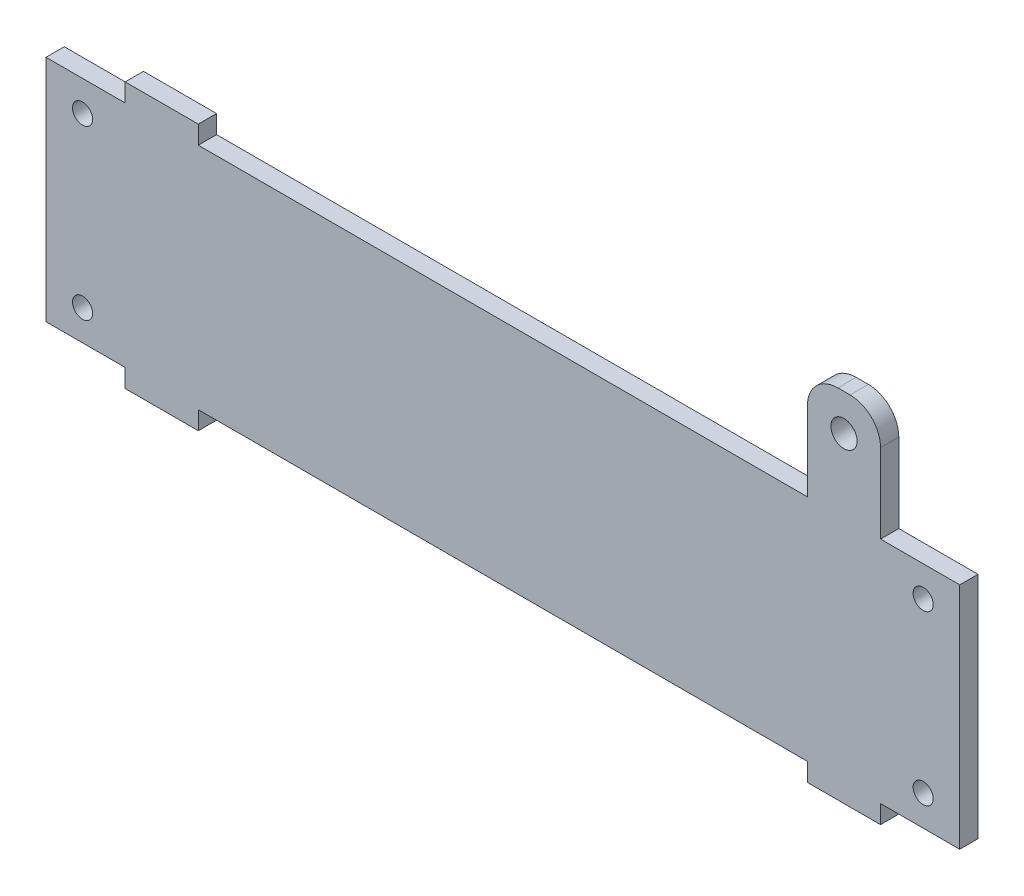
ISO-10303-21;
HEADER;
FILE_DESCRIPTION(('STEP AP214'),'2;1');
FILE_NAME('part.step','',(''),(''),'','','');
FILE_SCHEMA(('AUTOMOTIVE_DESIGN { 1 0 10303 214 1 1 1 1 }'));
ENDSEC;
DATA;
#1=APPLICATION_CONTEXT('core data for automotive mechanical design processes');
#2=APPLICATION_PROTOCOL_DEFINITION('international standard','automotive_design',2000,#1);
#3=PRODUCT_CONTEXT('',#1,'mechanical');
#4=PRODUCT('Part','Part','',(#3));
#5=PRODUCT_RELATED_PRODUCT_CATEGORY('part','',(#4));
#6=PRODUCT_DEFINITION_FORMATION('','',#4);
#7=PRODUCT_DEFINITION_CONTEXT('part definition',#1,'design');
#8=PRODUCT_DEFINITION('design','',#6,#7);
#9=PRODUCT_DEFINITION_SHAPE('','',#8);
#10=(LENGTH_UNIT() NAMED_UNIT(*) SI_UNIT(.MILLI.,.METRE.));
#11=(NAMED_UNIT(*) PLANE_ANGLE_UNIT() SI_UNIT($,.RADIAN.));
#12=(NAMED_UNIT(*) SI_UNIT($,.STERADIAN.) SOLID_ANGLE_UNIT());
#13=UNCERTAINTY_MEASURE_WITH_UNIT(LENGTH_MEASURE(1.E-05),#10,'distance_accuracy_value','');
#14=(GEOMETRIC_REPRESENTATION_CONTEXT(3) GLOBAL_UNCERTAINTY_ASSIGNED_CONTEXT((#13)) GLOBAL_UNIT_ASSIGNED_CONTEXT((#10,
#11,#12)) REPRESENTATION_CONTEXT('',''));
#15=CARTESIAN_POINT('',(0.,0.,0.));
#16=DIRECTION('',(0.,0.,1.));
#17=DIRECTION('',(1.,0.,0.));
#18=AXIS2_PLACEMENT_3D('',#15,#16,#17);
#19=CARTESIAN_POINT('',(0.,0.,3.));
#20=DIRECTION('',(0.,0.,-1.));
#21=DIRECTION('',(-1.,0.,0.));
#22=AXIS2_PLACEMENT_3D('',#19,#20,#21);
#23=PLANE('',#22);
#24=DIRECTION('',(0.,1.,0.));
#25=VECTOR('',#24,1.);
#26=CARTESIAN_POINT('',(137.,37.6,3.));
#27=LINE('',#26,#25);
#28=CARTESIAN_POINT('',(137.,37.6,3.));
#29=VERTEX_POINT('',#28);
#30=CARTESIAN_POINT('',(137.,50.6,3.));
#31=VERTEX_POINT('',#30);
#32=EDGE_CURVE('E229',#29,#31,#27,.T.);
#33=ORIENTED_EDGE('',*,*,#32,.T.);
#34=CARTESIAN_POINT('',(132.,50.6,3.));
#35=DIRECTION('',(0.,0.,-1.));
#36=DIRECTION('',(-1.,0.,0.));
#37=AXIS2_PLACEMENT_3D('',#34,#35,#36);
#38=CIRCLE('',#37,5.);
#39=CARTESIAN_POINT('',(132.,55.6,3.));
#40=VERTEX_POINT('',#39);
#41=EDGE_CURVE('E43',#31,#40,#38,.F.);
#42=ORIENTED_EDGE('',*,*,#41,.T.);
#43=DIRECTION('',(-1.,0.,0.));
#44=VECTOR('',#43,1.);
#45=CARTESIAN_POINT('',(125.,55.6,3.));
#46=LINE('',#45,#44);
#47=CARTESIAN_POINT('',(130.,55.6,3.));
#48=VERTEX_POINT('',#47);
#49=EDGE_CURVE('E228',#40,#48,#46,.T.);
#50=ORIENTED_EDGE('',*,*,#49,.T.);
#51=CARTESIAN_POINT('',(130.,50.6,3.));
#52=DIRECTION('',(0.,0.,-1.));
#53=DIRECTION('',(-1.,0.,0.));
#54=AXIS2_PLACEMENT_3D('',#51,#52,#53);
#55=CIRCLE('',#54,5.);
#56=CARTESIAN_POINT('',(125.,50.6,3.));
#57=VERTEX_POINT('',#56);
#58=EDGE_CURVE('E50',#48,#57,#55,.F.);
#59=ORIENTED_EDGE('',*,*,#58,.T.);
#60=DIRECTION('',(0.,-1.,0.));
#61=VECTOR('',#60,1.);
#62=CARTESIAN_POINT('',(125.,40.6,3.));
#63=LINE('',#62,#61);
#64=CARTESIAN_POINT('',(125.,37.6,3.));
#65=VERTEX_POINT('',#64);
#66=EDGE_CURVE('E237',#57,#65,#63,.T.);
#67=ORIENTED_EDGE('',*,*,#66,.T.);
#68=DIRECTION('',(-1.,0.,0.));
#69=VECTOR('',#68,1.);
#70=CARTESIAN_POINT('',(25.,37.6,3.));
#71=LINE('',#70,#69);
#72=CARTESIAN_POINT('',(25.,37.6,3.));
#73=VERTEX_POINT('',#72);
#74=EDGE_CURVE('E359',#65,#73,#71,.T.);
#75=ORIENTED_EDGE('',*,*,#74,.T.);
#76=DIRECTION('',(0.,1.,0.));
#77=VECTOR('',#76,1.);
#78=CARTESIAN_POINT('',(25.,37.6,3.));
#79=LINE('',#78,#77);
#80=CARTESIAN_POINT('',(25.,40.6,3.));
#81=VERTEX_POINT('',#80);
#82=EDGE_CURVE('E361',#73,#81,#79,.T.);
#83=ORIENTED_EDGE('',*,*,#82,.T.);
#84=DIRECTION('',(-1.,0.,0.));
#85=VECTOR('',#84,1.);
#86=CARTESIAN_POINT('',(13.,40.6,3.));
#87=LINE('',#86,#85);
#88=CARTESIAN_POINT('',(13.,40.6,3.));
#89=VERTEX_POINT('',#88);
#90=EDGE_CURVE('E363',#81,#89,#87,.T.);
#91=ORIENTED_EDGE('',*,*,#90,.T.);
#92=DIRECTION('',(0.,-1.,0.));
#93=VECTOR('',#92,1.);
#94=CARTESIAN_POINT('',(13.,37.6,3.));
#95=LINE('',#94,#93);
#96=CARTESIAN_POINT('',(13.,37.6,3.));
#97=VERTEX_POINT('',#96);
#98=EDGE_CURVE('E365',#89,#97,#95,.T.);
#99=ORIENTED_EDGE('',*,*,#98,.T.);
#100=DIRECTION('',(-1.,0.,0.));
#101=VECTOR('',#100,1.);
#102=CARTESIAN_POINT('',(0.,37.6,3.));
#103=LINE('',#102,#101);
#104=CARTESIAN_POINT('',(0.,37.6,3.));
#105=VERTEX_POINT('',#104);
#106=EDGE_CURVE('E202',#97,#105,#103,.T.);
#107=ORIENTED_EDGE('',*,*,#106,.T.);
#108=DIRECTION('',(0.,-1.,0.));
#109=VECTOR('',#108,1.);
#110=CARTESIAN_POINT('',(0.,0.,3.));
#111=LINE('',#110,#109);
#112=CARTESIAN_POINT('',(0.,0.,3.));
#113=VERTEX_POINT('',#112);
#114=EDGE_CURVE('E197',#105,#113,#111,.T.);
#115=ORIENTED_EDGE('',*,*,#114,.T.);
#116=DIRECTION('',(1.,0.,0.));
#117=VECTOR('',#116,1.);
#118=CARTESIAN_POINT('',(0.,0.,3.));
#119=LINE('',#118,#117);
#120=CARTESIAN_POINT('',(13.,0.,3.));
#121=VERTEX_POINT('',#120);
#122=EDGE_CURVE('E187',#113,#121,#119,.T.);
#123=ORIENTED_EDGE('',*,*,#122,.T.);
#124=DIRECTION('',(0.,-1.,0.));
#125=VECTOR('',#124,1.);
#126=CARTESIAN_POINT('',(13.,0.,3.));
#127=LINE('',#126,#125);
#128=CARTESIAN_POINT('',(13.,-3.,3.));
#129=VERTEX_POINT('',#128);
#130=EDGE_CURVE('E196',#121,#129,#127,.T.);
#131=ORIENTED_EDGE('',*,*,#130,.T.);
#132=DIRECTION('',(1.,0.,0.));
#133=VECTOR('',#132,1.);
#134=CARTESIAN_POINT('',(13.,-3.,3.));
#135=LINE('',#134,#133);
#136=CARTESIAN_POINT('',(25.,-3.,3.));
#137=VERTEX_POINT('',#136);
#138=EDGE_CURVE('E318',#129,#137,#135,.T.);
#139=ORIENTED_EDGE('',*,*,#138,.T.);
#140=DIRECTION('',(0.,1.,0.));
#141=VECTOR('',#140,1.);
#142=CARTESIAN_POINT('',(25.,0.,3.));
#143=LINE('',#142,#141);
#144=CARTESIAN_POINT('',(25.,0.,3.));
#145=VERTEX_POINT('',#144);
#146=EDGE_CURVE('E371',#137,#145,#143,.T.);
#147=ORIENTED_EDGE('',*,*,#146,.T.);
#148=DIRECTION('',(1.,0.,0.));
#149=VECTOR('',#148,1.);
#150=CARTESIAN_POINT('',(25.,0.,3.));
#151=LINE('',#150,#149);
#152=CARTESIAN_POINT('',(125.,0.,3.));
#153=VERTEX_POINT('',#152);
#154=EDGE_CURVE('E375',#145,#153,#151,.T.);
#155=ORIENTED_EDGE('',*,*,#154,.T.);
#156=DIRECTION('',(0.,-1.,0.));
#157=VECTOR('',#156,1.);
#158=CARTESIAN_POINT('',(125.,0.,3.));
#159=LINE('',#158,#157);
#160=CARTESIAN_POINT('',(125.,-3.,3.));
#161=VERTEX_POINT('',#160);
#162=EDGE_CURVE('E377',#153,#161,#159,.T.);
#163=ORIENTED_EDGE('',*,*,#162,.T.);
#164=DIRECTION('',(1.,0.,0.));
#165=VECTOR('',#164,1.);
#166=CARTESIAN_POINT('',(137.,-3.,3.));
#167=LINE('',#166,#165);
#168=CARTESIAN_POINT('',(137.,-3.,3.));
#169=VERTEX_POINT('',#168);
#170=EDGE_CURVE('E379',#161,#169,#167,.T.);
#171=ORIENTED_EDGE('',*,*,#170,.T.);
#172=DIRECTION('',(0.,1.,0.));
#173=VECTOR('',#172,1.);
#174=CARTESIAN_POINT('',(137.,0.,3.));
#175=LINE('',#174,#173);
#176=CARTESIAN_POINT('',(137.,0.,3.));
#177=VERTEX_POINT('',#176);
#178=EDGE_CURVE('E381',#169,#177,#175,.T.);
#179=ORIENTED_EDGE('',*,*,#178,.T.);
#180=DIRECTION('',(1.,0.,0.));
#181=VECTOR('',#180,1.);
#182=CARTESIAN_POINT('',(137.,0.,3.));
#183=LINE('',#182,#181);
#184=CARTESIAN_POINT('',(150.,0.,3.));
#185=VERTEX_POINT('',#184);
#186=EDGE_CURVE('E354',#177,#185,#183,.T.);
#187=ORIENTED_EDGE('',*,*,#186,.T.);
#188=DIRECTION('',(0.,1.,0.));
#189=VECTOR('',#188,1.);
#190=CARTESIAN_POINT('',(150.,0.,3.));
#191=LINE('',#190,#189);
#192=CARTESIAN_POINT('',(150.,37.6,3.));
#193=VERTEX_POINT('',#192);
#194=EDGE_CURVE('E351',#185,#193,#191,.T.);
#195=ORIENTED_EDGE('',*,*,#194,.T.);
#196=DIRECTION('',(-1.,0.,0.));
#197=VECTOR('',#196,1.);
#198=CARTESIAN_POINT('',(137.,37.6,3.));
#199=LINE('',#198,#197);
#200=EDGE_CURVE('E350',#193,#29,#199,.T.);
#201=ORIENTED_EDGE('',*,*,#200,.T.);
#202=EDGE_LOOP('',(#33,#42,#50,#59,#67,#75,#83,#91,#99,#107,#115,#123,#131,#139,#147,#155,#163,
#171,#179,#187,#195,#201));
#203=FACE_BOUND('',#202,.T.);
#204=CARTESIAN_POINT('',(131.,49.6,3.));
#205=DIRECTION('',(0.,0.,1.));
#206=DIRECTION('',(1.,0.,0.));
#207=AXIS2_PLACEMENT_3D('',#204,#205,#206);
#208=CIRCLE('',#207,2.15000000000002);
#209=CARTESIAN_POINT('',(133.15,49.6,3.));
#210=VERTEX_POINT('',#209);
#211=EDGE_CURVE('E368',#210,#210,#208,.T.);
#212=ORIENTED_EDGE('',*,*,#211,.F.);
#213=EDGE_LOOP('',(#212));
#214=FACE_BOUND('',#213,.T.);
#215=CARTESIAN_POINT('',(6.,32.6,3.));
#216=DIRECTION('',(0.,0.,1.));
#217=DIRECTION('',(1.,0.,0.));
#218=AXIS2_PLACEMENT_3D('',#215,#216,#217);
#219=CIRCLE('',#218,1.65);
#220=CARTESIAN_POINT('',(7.65,32.6,3.));
#221=VERTEX_POINT('',#220);
#222=EDGE_CURVE('E708',#221,#221,#219,.T.);
#223=ORIENTED_EDGE('',*,*,#222,.F.);
#224=EDGE_LOOP('',(#223));
#225=FACE_BOUND('',#224,.T.);
#226=CARTESIAN_POINT('',(6.,5.,3.));
#227=DIRECTION('',(0.,0.,1.));
#228=DIRECTION('',(1.,0.,0.));
#229=AXIS2_PLACEMENT_3D('',#226,#227,#228);
#230=CIRCLE('',#229,1.65);
#231=CARTESIAN_POINT('',(7.65,5.,3.));
#232=VERTEX_POINT('',#231);
#233=EDGE_CURVE('E702',#232,#232,#230,.T.);
#234=ORIENTED_EDGE('',*,*,#233,.F.);
#235=EDGE_LOOP('',(#234));
#236=FACE_BOUND('',#235,.T.);
#237=CARTESIAN_POINT('',(144.,32.6,3.));
#238=DIRECTION('',(0.,0.,1.));
#239=DIRECTION('',(-1.,0.,0.));
#240=AXIS2_PLACEMENT_3D('',#237,#238,#239);
#241=CIRCLE('',#240,1.65000000000002);
#242=CARTESIAN_POINT('',(142.35,32.6,3.));
#243=VERTEX_POINT('',#242);
#244=EDGE_CURVE('E696',#243,#243,#241,.T.);
#245=ORIENTED_EDGE('',*,*,#244,.F.);
#246=EDGE_LOOP('',(#245));
#247=FACE_BOUND('',#246,.T.);
#248=CARTESIAN_POINT('',(144.,5.,3.));
#249=DIRECTION('',(0.,0.,1.));
#250=DIRECTION('',(-1.,0.,0.));
#251=AXIS2_PLACEMENT_3D('',#248,#249,#250);
#252=CIRCLE('',#251,1.65000000000002);
#253=CARTESIAN_POINT('',(142.35,5.,3.));
#254=VERTEX_POINT('',#253);
#255=EDGE_CURVE('E687',#254,#254,#252,.T.);
#256=ORIENTED_EDGE('',*,*,#255,.F.);
#257=EDGE_LOOP('',(#256));
#258=FACE_BOUND('',#257,.T.);
#259=ADVANCED_FACE('F35',(#203,#214,#225,#236,#247,#258),#23,.F.);
#260=CARTESIAN_POINT('',(0.,0.,0.));
#261=DIRECTION('',(0.,0.,-1.));
#262=DIRECTION('',(-1.,0.,0.));
#263=AXIS2_PLACEMENT_3D('',#260,#261,#262);
#264=PLANE('',#263);
#265=CARTESIAN_POINT('',(144.,32.6,0.));
#266=DIRECTION('',(0.,0.,1.));
#267=DIRECTION('',(-1.,0.,0.));
#268=AXIS2_PLACEMENT_3D('',#265,#266,#267);
#269=CIRCLE('',#268,1.65000000000002);
#270=CARTESIAN_POINT('',(142.35,32.6,0.));
#271=VERTEX_POINT('',#270);
#272=EDGE_CURVE('E693',#271,#271,#269,.T.);
#273=ORIENTED_EDGE('',*,*,#272,.T.);
#274=EDGE_LOOP('',(#273));
#275=FACE_BOUND('',#274,.T.);
#276=CARTESIAN_POINT('',(6.,32.6,0.));
#277=DIRECTION('',(0.,0.,1.));
#278=DIRECTION('',(1.,0.,0.));
#279=AXIS2_PLACEMENT_3D('',#276,#277,#278);
#280=CIRCLE('',#279,1.65);
#281=CARTESIAN_POINT('',(7.65,32.6,0.));
#282=VERTEX_POINT('',#281);
#283=EDGE_CURVE('E705',#282,#282,#280,.T.);
#284=ORIENTED_EDGE('',*,*,#283,.T.);
#285=EDGE_LOOP('',(#284));
#286=FACE_BOUND('',#285,.T.);
#287=DIRECTION('',(-1.,0.,0.));
#288=VECTOR('',#287,1.);
#289=CARTESIAN_POINT('',(125.,55.6,0.));
#290=LINE('',#289,#288);
#291=CARTESIAN_POINT('',(132.,55.6,0.));
#292=VERTEX_POINT('',#291);
#293=CARTESIAN_POINT('',(130.,55.6,0.));
#294=VERTEX_POINT('',#293);
#295=EDGE_CURVE('E246',#292,#294,#290,.T.);
#296=ORIENTED_EDGE('',*,*,#295,.F.);
#297=CARTESIAN_POINT('',(132.,50.6,0.));
#298=DIRECTION('',(0.,0.,-1.));
#299=DIRECTION('',(-1.,0.,0.));
#300=AXIS2_PLACEMENT_3D('',#297,#298,#299);
#301=CIRCLE('',#300,5.);
#302=CARTESIAN_POINT('',(137.,50.6,0.));
#303=VERTEX_POINT('',#302);
#304=EDGE_CURVE('E223',#292,#303,#301,.T.);
#305=ORIENTED_EDGE('',*,*,#304,.T.);
#306=DIRECTION('',(0.,1.,0.));
#307=VECTOR('',#306,1.);
#308=CARTESIAN_POINT('',(137.,55.6,0.));
#309=LINE('',#308,#307);
#310=CARTESIAN_POINT('',(137.,37.6,0.));
#311=VERTEX_POINT('',#310);
#312=EDGE_CURVE('E244',#311,#303,#309,.T.);
#313=ORIENTED_EDGE('',*,*,#312,.F.);
#314=DIRECTION('',(-1.,0.,0.));
#315=VECTOR('',#314,1.);
#316=CARTESIAN_POINT('',(137.,37.6,0.));
#317=LINE('',#316,#315);
#318=CARTESIAN_POINT('',(150.,37.6,0.));
#319=VERTEX_POINT('',#318);
#320=EDGE_CURVE('E251',#319,#311,#317,.T.);
#321=ORIENTED_EDGE('',*,*,#320,.F.);
#322=DIRECTION('',(0.,1.,0.));
#323=VECTOR('',#322,1.);
#324=CARTESIAN_POINT('',(150.,0.,0.));
#325=LINE('',#324,#323);
#326=CARTESIAN_POINT('',(150.,0.,0.));
#327=VERTEX_POINT('',#326);
#328=EDGE_CURVE('E255',#327,#319,#325,.T.);
#329=ORIENTED_EDGE('',*,*,#328,.F.);
#330=DIRECTION('',(1.,0.,0.));
#331=VECTOR('',#330,1.);
#332=CARTESIAN_POINT('',(137.,0.,0.));
#333=LINE('',#332,#331);
#334=CARTESIAN_POINT('',(137.,0.,0.));
#335=VERTEX_POINT('',#334);
#336=EDGE_CURVE('E339',#335,#327,#333,.T.);
#337=ORIENTED_EDGE('',*,*,#336,.F.);
#338=DIRECTION('',(0.,1.,0.));
#339=VECTOR('',#338,1.);
#340=CARTESIAN_POINT('',(137.,0.,0.));
#341=LINE('',#340,#339);
#342=CARTESIAN_POINT('',(137.,-3.,0.));
#343=VERTEX_POINT('',#342);
#344=EDGE_CURVE('E337',#343,#335,#341,.T.);
#345=ORIENTED_EDGE('',*,*,#344,.F.);
#346=DIRECTION('',(1.,0.,0.));
#347=VECTOR('',#346,1.);
#348=CARTESIAN_POINT('',(137.,-3.,0.));
#349=LINE('',#348,#347);
#350=CARTESIAN_POINT('',(125.,-3.,0.));
#351=VERTEX_POINT('',#350);
#352=EDGE_CURVE('E335',#351,#343,#349,.T.);
#353=ORIENTED_EDGE('',*,*,#352,.F.);
#354=DIRECTION('',(0.,-1.,0.));
#355=VECTOR('',#354,1.);
#356=CARTESIAN_POINT('',(125.,0.,0.));
#357=LINE('',#356,#355);
#358=CARTESIAN_POINT('',(125.,0.,0.));
#359=VERTEX_POINT('',#358);
#360=EDGE_CURVE('E333',#359,#351,#357,.T.);
#361=ORIENTED_EDGE('',*,*,#360,.F.);
#362=DIRECTION('',(1.,0.,0.));
#363=VECTOR('',#362,1.);
#364=CARTESIAN_POINT('',(25.,0.,0.));
#365=LINE('',#364,#363);
#366=CARTESIAN_POINT('',(25.,0.,0.));
#367=VERTEX_POINT('',#366);
#368=EDGE_CURVE('E326',#367,#359,#365,.T.);
#369=ORIENTED_EDGE('',*,*,#368,.F.);
#370=DIRECTION('',(0.,1.,0.));
#371=VECTOR('',#370,1.);
#372=CARTESIAN_POINT('',(25.,0.,0.));
#373=LINE('',#372,#371);
#374=CARTESIAN_POINT('',(25.,-3.,0.));
#375=VERTEX_POINT('',#374);
#376=EDGE_CURVE('E324',#375,#367,#373,.T.);
#377=ORIENTED_EDGE('',*,*,#376,.F.);
#378=DIRECTION('',(1.,0.,0.));
#379=VECTOR('',#378,1.);
#380=CARTESIAN_POINT('',(13.,-3.,0.));
#381=LINE('',#380,#379);
#382=CARTESIAN_POINT('',(13.,-3.,0.));
#383=VERTEX_POINT('',#382);
#384=EDGE_CURVE('E317',#383,#375,#381,.T.);
#385=ORIENTED_EDGE('',*,*,#384,.F.);
#386=DIRECTION('',(0.,-1.,0.));
#387=VECTOR('',#386,1.);
#388=CARTESIAN_POINT('',(13.,0.,0.));
#389=LINE('',#388,#387);
#390=CARTESIAN_POINT('',(13.,0.,0.));
#391=VERTEX_POINT('',#390);
#392=EDGE_CURVE('E322',#391,#383,#389,.T.);
#393=ORIENTED_EDGE('',*,*,#392,.F.);
#394=DIRECTION('',(1.,0.,0.));
#395=VECTOR('',#394,1.);
#396=CARTESIAN_POINT('',(0.,0.,0.));
#397=LINE('',#396,#395);
#398=CARTESIAN_POINT('',(0.,0.,0.));
#399=VERTEX_POINT('',#398);
#400=EDGE_CURVE('E328',#399,#391,#397,.T.);
#401=ORIENTED_EDGE('',*,*,#400,.F.);
#402=DIRECTION('',(0.,-1.,0.));
#403=VECTOR('',#402,1.);
#404=CARTESIAN_POINT('',(0.,0.,0.));
#405=LINE('',#404,#403);
#406=CARTESIAN_POINT('',(0.,37.6,0.));
#407=VERTEX_POINT('',#406);
#408=EDGE_CURVE('E210',#407,#399,#405,.T.);
#409=ORIENTED_EDGE('',*,*,#408,.F.);
#410=DIRECTION('',(-1.,0.,0.));
#411=VECTOR('',#410,1.);
#412=CARTESIAN_POINT('',(0.,37.6,0.));
#413=LINE('',#412,#411);
#414=CARTESIAN_POINT('',(13.,37.6,0.));
#415=VERTEX_POINT('',#414);
#416=EDGE_CURVE('E206',#415,#407,#413,.T.);
#417=ORIENTED_EDGE('',*,*,#416,.F.);
#418=DIRECTION('',(0.,-1.,0.));
#419=VECTOR('',#418,1.);
#420=CARTESIAN_POINT('',(13.,37.6,0.));
#421=LINE('',#420,#419);
#422=CARTESIAN_POINT('',(13.,40.6,0.));
#423=VERTEX_POINT('',#422);
#424=EDGE_CURVE('E266',#423,#415,#421,.T.);
#425=ORIENTED_EDGE('',*,*,#424,.F.);
#426=DIRECTION('',(-1.,0.,0.));
#427=VECTOR('',#426,1.);
#428=CARTESIAN_POINT('',(13.,40.6,0.));
#429=LINE('',#428,#427);
#430=CARTESIAN_POINT('',(25.,40.6,0.));
#431=VERTEX_POINT('',#430);
#432=EDGE_CURVE('E264',#431,#423,#429,.T.);
#433=ORIENTED_EDGE('',*,*,#432,.F.);
#434=DIRECTION('',(0.,1.,0.));
#435=VECTOR('',#434,1.);
#436=CARTESIAN_POINT('',(25.,37.6,0.));
#437=LINE('',#436,#435);
#438=CARTESIAN_POINT('',(25.,37.6,0.));
#439=VERTEX_POINT('',#438);
#440=EDGE_CURVE('E262',#439,#431,#437,.T.);
#441=ORIENTED_EDGE('',*,*,#440,.F.);
#442=DIRECTION('',(-1.,0.,0.));
#443=VECTOR('',#442,1.);
#444=CARTESIAN_POINT('',(25.,37.6,0.));
#445=LINE('',#444,#443);
#446=CARTESIAN_POINT('',(125.,37.6,0.));
#447=VERTEX_POINT('',#446);
#448=EDGE_CURVE('E260',#447,#439,#445,.T.);
#449=ORIENTED_EDGE('',*,*,#448,.F.);
#450=DIRECTION('',(0.,-1.,0.));
#451=VECTOR('',#450,1.);
#452=CARTESIAN_POINT('',(125.,37.6,0.));
#453=LINE('',#452,#451);
#454=CARTESIAN_POINT('',(125.,50.6,0.));
#455=VERTEX_POINT('',#454);
#456=EDGE_CURVE('E253',#455,#447,#453,.T.);
#457=ORIENTED_EDGE('',*,*,#456,.F.);
#458=CARTESIAN_POINT('',(130.,50.6,0.));
#459=DIRECTION('',(0.,0.,-1.));
#460=DIRECTION('',(-1.,0.,0.));
#461=AXIS2_PLACEMENT_3D('',#458,#459,#460);
#462=CIRCLE('',#461,5.);
#463=EDGE_CURVE('E221',#455,#294,#462,.T.);
#464=ORIENTED_EDGE('',*,*,#463,.T.);
#465=EDGE_LOOP('',(#296,#305,#313,#321,#329,#337,#345,#353,#361,#369,#377,#385,#393,#401,#409,
#417,#425,#433,#441,#449,#457,#464));
#466=FACE_BOUND('',#465,.T.);
#467=CARTESIAN_POINT('',(131.,49.6,0.));
#468=DIRECTION('',(0.,0.,1.));
#469=DIRECTION('',(1.,0.,0.));
#470=AXIS2_PLACEMENT_3D('',#467,#468,#469);
#471=CIRCLE('',#470,2.15000000000002);
#472=CARTESIAN_POINT('',(133.15,49.6,0.));
#473=VERTEX_POINT('',#472);
#474=EDGE_CURVE('E711',#473,#473,#471,.T.);
#475=ORIENTED_EDGE('',*,*,#474,.T.);
#476=EDGE_LOOP('',(#475));
#477=FACE_BOUND('',#476,.T.);
#478=CARTESIAN_POINT('',(6.,5.,0.));
#479=DIRECTION('',(0.,0.,1.));
#480=DIRECTION('',(1.,0.,0.));
#481=AXIS2_PLACEMENT_3D('',#478,#479,#480);
#482=CIRCLE('',#481,1.65);
#483=CARTESIAN_POINT('',(7.65,5.,0.));
#484=VERTEX_POINT('',#483);
#485=EDGE_CURVE('E699',#484,#484,#482,.T.);
#486=ORIENTED_EDGE('',*,*,#485,.T.);
#487=EDGE_LOOP('',(#486));
#488=FACE_BOUND('',#487,.T.);
#489=CARTESIAN_POINT('',(144.,5.,0.));
#490=DIRECTION('',(0.,0.,1.));
#491=DIRECTION('',(-1.,0.,0.));
#492=AXIS2_PLACEMENT_3D('',#489,#490,#491);
#493=CIRCLE('',#492,1.65000000000002);
#494=CARTESIAN_POINT('',(142.35,5.,0.));
#495=VERTEX_POINT('',#494);
#496=EDGE_CURVE('E690',#495,#495,#493,.T.);
#497=ORIENTED_EDGE('',*,*,#496,.T.);
#498=EDGE_LOOP('',(#497));
#499=FACE_BOUND('',#498,.T.);
#500=ADVANCED_FACE('F241',(#275,#286,#466,#477,#488,#499),#264,.T.);
#501=CARTESIAN_POINT('',(0.,0.,3.));
#502=DIRECTION('',(1.,0.,0.));
#503=DIRECTION('',(0.,0.,-1.));
#504=AXIS2_PLACEMENT_3D('',#501,#502,#503);
#505=PLANE('',#504);
#506=ORIENTED_EDGE('',*,*,#408,.T.);
#507=DIRECTION('',(0.,0.,-1.));
#508=VECTOR('',#507,1.);
#509=CARTESIAN_POINT('',(0.,0.,3.));
#510=LINE('',#509,#508);
#511=EDGE_CURVE('E191',#113,#399,#510,.T.);
#512=ORIENTED_EDGE('',*,*,#511,.F.);
#513=ORIENTED_EDGE('',*,*,#114,.F.);
#514=DIRECTION('',(0.,0.,-1.));
#515=VECTOR('',#514,1.);
#516=CARTESIAN_POINT('',(0.,37.6,3.));
#517=LINE('',#516,#515);
#518=EDGE_CURVE('E269',#105,#407,#517,.T.);
#519=ORIENTED_EDGE('',*,*,#518,.T.);
#520=EDGE_LOOP('',(#506,#512,#513,#519));
#521=FACE_BOUND('',#520,.T.);
#522=ADVANCED_FACE('F208',(#521),#505,.F.);
#523=CARTESIAN_POINT('',(0.,0.,3.));
#524=DIRECTION('',(0.,1.,0.));
#525=DIRECTION('',(0.,0.,1.));
#526=AXIS2_PLACEMENT_3D('',#523,#524,#525);
#527=PLANE('',#526);
#528=ORIENTED_EDGE('',*,*,#400,.T.);
#529=DIRECTION('',(0.,0.,-1.));
#530=VECTOR('',#529,1.);
#531=CARTESIAN_POINT('',(13.,0.,3.));
#532=LINE('',#531,#530);
#533=EDGE_CURVE('E194',#121,#391,#532,.T.);
#534=ORIENTED_EDGE('',*,*,#533,.F.);
#535=ORIENTED_EDGE('',*,*,#122,.F.);
#536=ORIENTED_EDGE('',*,*,#511,.T.);
#537=EDGE_LOOP('',(#528,#534,#535,#536));
#538=FACE_BOUND('',#537,.T.);
#539=ADVANCED_FACE('F189',(#538),#527,.F.);
#540=CARTESIAN_POINT('',(13.,0.,3.));
#541=DIRECTION('',(1.,0.,0.));
#542=DIRECTION('',(0.,0.,-1.));
#543=AXIS2_PLACEMENT_3D('',#540,#541,#542);
#544=PLANE('',#543);
#545=ORIENTED_EDGE('',*,*,#392,.T.);
#546=DIRECTION('',(0.,0.,-1.));
#547=VECTOR('',#546,1.);
#548=CARTESIAN_POINT('',(13.,-3.,3.));
#549=LINE('',#548,#547);
#550=EDGE_CURVE('E215',#129,#383,#549,.T.);
#551=ORIENTED_EDGE('',*,*,#550,.F.);
#552=ORIENTED_EDGE('',*,*,#130,.F.);
#553=ORIENTED_EDGE('',*,*,#533,.T.);
#554=EDGE_LOOP('',(#545,#551,#552,#553));
#555=FACE_BOUND('',#554,.T.);
#556=ADVANCED_FACE('F369',(#555),#544,.F.);
#557=CARTESIAN_POINT('',(13.,-3.,3.));
#558=DIRECTION('',(0.,1.,0.));
#559=DIRECTION('',(0.,0.,1.));
#560=AXIS2_PLACEMENT_3D('',#557,#558,#559);
#561=PLANE('',#560);
#562=ORIENTED_EDGE('',*,*,#384,.T.);
#563=DIRECTION('',(0.,0.,-1.));
#564=VECTOR('',#563,1.);
#565=CARTESIAN_POINT('',(25.,-3.,3.));
#566=LINE('',#565,#564);
#567=EDGE_CURVE('E308',#137,#375,#566,.T.);
#568=ORIENTED_EDGE('',*,*,#567,.F.);
#569=ORIENTED_EDGE('',*,*,#138,.F.);
#570=ORIENTED_EDGE('',*,*,#550,.T.);
#571=EDGE_LOOP('',(#562,#568,#569,#570));
#572=FACE_BOUND('',#571,.T.);
#573=ADVANCED_FACE('F315',(#572),#561,.F.);
#574=CARTESIAN_POINT('',(25.,0.,3.));
#575=DIRECTION('',(-1.,0.,0.));
#576=DIRECTION('',(0.,0.,1.));
#577=AXIS2_PLACEMENT_3D('',#574,#575,#576);
#578=PLANE('',#577);
#579=ORIENTED_EDGE('',*,*,#376,.T.);
#580=DIRECTION('',(0.,0.,-1.));
#581=VECTOR('',#580,1.);
#582=CARTESIAN_POINT('',(25.,0.,3.));
#583=LINE('',#582,#581);
#584=EDGE_CURVE('E305',#145,#367,#583,.T.);
#585=ORIENTED_EDGE('',*,*,#584,.F.);
#586=ORIENTED_EDGE('',*,*,#146,.F.);
#587=ORIENTED_EDGE('',*,*,#567,.T.);
#588=EDGE_LOOP('',(#579,#585,#586,#587));
#589=FACE_BOUND('',#588,.T.);
#590=ADVANCED_FACE('F407',(#589),#578,.F.);
#591=CARTESIAN_POINT('',(25.,0.,3.));
#592=DIRECTION('',(0.,1.,0.));
#593=DIRECTION('',(0.,0.,1.));
#594=AXIS2_PLACEMENT_3D('',#591,#592,#593);
#595=PLANE('',#594);
#596=ORIENTED_EDGE('',*,*,#368,.T.);
#597=DIRECTION('',(0.,0.,-1.));
#598=VECTOR('',#597,1.);
#599=CARTESIAN_POINT('',(125.,0.,3.));
#600=LINE('',#599,#598);
#601=EDGE_CURVE('E302',#153,#359,#600,.T.);
#602=ORIENTED_EDGE('',*,*,#601,.F.);
#603=ORIENTED_EDGE('',*,*,#154,.F.);
#604=ORIENTED_EDGE('',*,*,#584,.T.);
#605=EDGE_LOOP('',(#596,#602,#603,#604));
#606=FACE_BOUND('',#605,.T.);
#607=ADVANCED_FACE('F402',(#606),#595,.F.);
#608=CARTESIAN_POINT('',(125.,0.,3.));
#609=DIRECTION('',(1.,0.,0.));
#610=DIRECTION('',(0.,0.,-1.));
#611=AXIS2_PLACEMENT_3D('',#608,#609,#610);
#612=PLANE('',#611);
#613=ORIENTED_EDGE('',*,*,#360,.T.);
#614=DIRECTION('',(0.,0.,-1.));
#615=VECTOR('',#614,1.);
#616=CARTESIAN_POINT('',(125.,-3.,3.));
#617=LINE('',#616,#615);
#618=EDGE_CURVE('E299',#161,#351,#617,.T.);
#619=ORIENTED_EDGE('',*,*,#618,.F.);
#620=ORIENTED_EDGE('',*,*,#162,.F.);
#621=ORIENTED_EDGE('',*,*,#601,.T.);
#622=EDGE_LOOP('',(#613,#619,#620,#621));
#623=FACE_BOUND('',#622,.T.);
#624=ADVANCED_FACE('F399',(#623),#612,.F.);
#625=CARTESIAN_POINT('',(137.,-3.,3.));
#626=DIRECTION('',(0.,1.,0.));
#627=DIRECTION('',(0.,0.,1.));
#628=AXIS2_PLACEMENT_3D('',#625,#626,#627);
#629=PLANE('',#628);
#630=ORIENTED_EDGE('',*,*,#352,.T.);
#631=DIRECTION('',(0.,0.,-1.));
#632=VECTOR('',#631,1.);
#633=CARTESIAN_POINT('',(137.,-3.,3.));
#634=LINE('',#633,#632);
#635=EDGE_CURVE('E296',#169,#343,#634,.T.);
#636=ORIENTED_EDGE('',*,*,#635,.F.);
#637=ORIENTED_EDGE('',*,*,#170,.F.);
#638=ORIENTED_EDGE('',*,*,#618,.T.);
#639=EDGE_LOOP('',(#630,#636,#637,#638));
#640=FACE_BOUND('',#639,.T.);
#641=ADVANCED_FACE('F395',(#640),#629,.F.);
#642=CARTESIAN_POINT('',(137.,0.,3.));
#643=DIRECTION('',(-1.,0.,0.));
#644=DIRECTION('',(0.,0.,1.));
#645=AXIS2_PLACEMENT_3D('',#642,#643,#644);
#646=PLANE('',#645);
#647=ORIENTED_EDGE('',*,*,#344,.T.);
#648=DIRECTION('',(0.,0.,-1.));
#649=VECTOR('',#648,1.);
#650=CARTESIAN_POINT('',(137.,0.,3.));
#651=LINE('',#650,#649);
#652=EDGE_CURVE('E293',#177,#335,#651,.T.);
#653=ORIENTED_EDGE('',*,*,#652,.F.);
#654=ORIENTED_EDGE('',*,*,#178,.F.);
#655=ORIENTED_EDGE('',*,*,#635,.T.);
#656=EDGE_LOOP('',(#647,#653,#654,#655));
#657=FACE_BOUND('',#656,.T.);
#658=ADVANCED_FACE('F391',(#657),#646,.F.);
#659=CARTESIAN_POINT('',(137.,0.,3.));
#660=DIRECTION('',(0.,1.,0.));
#661=DIRECTION('',(0.,0.,1.));
#662=AXIS2_PLACEMENT_3D('',#659,#660,#661);
#663=PLANE('',#662);
#664=ORIENTED_EDGE('',*,*,#336,.T.);
#665=DIRECTION('',(0.,0.,-1.));
#666=VECTOR('',#665,1.);
#667=CARTESIAN_POINT('',(150.,0.,3.));
#668=LINE('',#667,#666);
#669=EDGE_CURVE('E290',#185,#327,#668,.T.);
#670=ORIENTED_EDGE('',*,*,#669,.F.);
#671=ORIENTED_EDGE('',*,*,#186,.F.);
#672=ORIENTED_EDGE('',*,*,#652,.T.);
#673=EDGE_LOOP('',(#664,#670,#671,#672));
#674=FACE_BOUND('',#673,.T.);
#675=ADVANCED_FACE('F386',(#674),#663,.F.);
#676=CARTESIAN_POINT('',(150.,0.,3.));
#677=DIRECTION('',(-1.,0.,0.));
#678=DIRECTION('',(0.,0.,1.));
#679=AXIS2_PLACEMENT_3D('',#676,#677,#678);
#680=PLANE('',#679);
#681=ORIENTED_EDGE('',*,*,#328,.T.);
#682=DIRECTION('',(0.,0.,-1.));
#683=VECTOR('',#682,1.);
#684=CARTESIAN_POINT('',(150.,37.6,3.));
#685=LINE('',#684,#683);
#686=EDGE_CURVE('E287',#193,#319,#685,.T.);
#687=ORIENTED_EDGE('',*,*,#686,.F.);
#688=ORIENTED_EDGE('',*,*,#194,.F.);
#689=ORIENTED_EDGE('',*,*,#669,.T.);
#690=EDGE_LOOP('',(#681,#687,#688,#689));
#691=FACE_BOUND('',#690,.T.);
#692=ADVANCED_FACE('F343',(#691),#680,.F.);
#693=CARTESIAN_POINT('',(137.,37.6,3.));
#694=DIRECTION('',(0.,-1.,0.));
#695=DIRECTION('',(0.,0.,-1.));
#696=AXIS2_PLACEMENT_3D('',#693,#694,#695);
#697=PLANE('',#696);
#698=ORIENTED_EDGE('',*,*,#320,.T.);
#699=DIRECTION('',(0.,0.,-1.));
#700=VECTOR('',#699,1.);
#701=CARTESIAN_POINT('',(137.,37.6,3.));
#702=LINE('',#701,#700);
#703=EDGE_CURVE('E250',#29,#311,#702,.T.);
#704=ORIENTED_EDGE('',*,*,#703,.F.);
#705=ORIENTED_EDGE('',*,*,#200,.F.);
#706=ORIENTED_EDGE('',*,*,#686,.T.);
#707=EDGE_LOOP('',(#698,#704,#705,#706));
#708=FACE_BOUND('',#707,.T.);
#709=ADVANCED_FACE('F349',(#708),#697,.F.);
#710=CARTESIAN_POINT('',(137.,55.6,3.));
#711=DIRECTION('',(-1.,0.,0.));
#712=DIRECTION('',(0.,-1.,0.));
#713=AXIS2_PLACEMENT_3D('',#710,#711,#712);
#714=PLANE('',#713);
#715=ORIENTED_EDGE('',*,*,#312,.T.);
#716=DIRECTION('',(0.,0.,-1.));
#717=VECTOR('',#716,1.);
#718=CARTESIAN_POINT('',(137.,50.6,3.));
#719=LINE('',#718,#717);
#720=EDGE_CURVE('E58',#303,#31,#719,.F.);
#721=ORIENTED_EDGE('',*,*,#720,.T.);
#722=ORIENTED_EDGE('',*,*,#32,.F.);
#723=ORIENTED_EDGE('',*,*,#703,.T.);
#724=EDGE_LOOP('',(#715,#721,#722,#723));
#725=FACE_BOUND('',#724,.T.);
#726=ADVANCED_FACE('F248',(#725),#714,.F.);
#727=CARTESIAN_POINT('',(125.,55.6,3.));
#728=DIRECTION('',(0.,-1.,0.));
#729=DIRECTION('',(0.,0.,-1.));
#730=AXIS2_PLACEMENT_3D('',#727,#728,#729);
#731=PLANE('',#730);
#732=ORIENTED_EDGE('',*,*,#49,.F.);
#733=DIRECTION('',(0.,0.,-1.));
#734=VECTOR('',#733,1.);
#735=CARTESIAN_POINT('',(132.,55.6,3.));
#736=LINE('',#735,#734);
#737=EDGE_CURVE('E213',#40,#292,#736,.T.);
#738=ORIENTED_EDGE('',*,*,#737,.T.);
#739=ORIENTED_EDGE('',*,*,#295,.T.);
#740=DIRECTION('',(0.,0.,-1.));
#741=VECTOR('',#740,1.);
#742=CARTESIAN_POINT('',(130.,55.6,3.));
#743=LINE('',#742,#741);
#744=EDGE_CURVE('E211',#294,#48,#743,.F.);
#745=ORIENTED_EDGE('',*,*,#744,.T.);
#746=EDGE_LOOP('',(#732,#738,#739,#745));
#747=FACE_BOUND('',#746,.T.);
#748=ADVANCED_FACE('F233',(#747),#731,.F.);
#749=CARTESIAN_POINT('',(125.,37.6,3.));
#750=DIRECTION('',(1.,0.,0.));
#751=DIRECTION('',(0.,0.,-1.));
#752=AXIS2_PLACEMENT_3D('',#749,#750,#751);
#753=PLANE('',#752);
#754=ORIENTED_EDGE('',*,*,#66,.F.);
#755=DIRECTION('',(0.,0.,-1.));
#756=VECTOR('',#755,1.);
#757=CARTESIAN_POINT('',(125.,50.6,3.));
#758=LINE('',#757,#756);
#759=EDGE_CURVE('E11',#57,#455,#758,.T.);
#760=ORIENTED_EDGE('',*,*,#759,.T.);
#761=ORIENTED_EDGE('',*,*,#456,.T.);
#762=DIRECTION('',(0.,0.,-1.));
#763=VECTOR('',#762,1.);
#764=CARTESIAN_POINT('',(125.,37.6,3.));
#765=LINE('',#764,#763);
#766=EDGE_CURVE('E283',#65,#447,#765,.T.);
#767=ORIENTED_EDGE('',*,*,#766,.F.);
#768=EDGE_LOOP('',(#754,#760,#761,#767));
#769=FACE_BOUND('',#768,.T.);
#770=ADVANCED_FACE('F446',(#769),#753,.F.);
#771=CARTESIAN_POINT('',(25.,37.6,3.));
#772=DIRECTION('',(0.,-1.,0.));
#773=DIRECTION('',(0.,0.,-1.));
#774=AXIS2_PLACEMENT_3D('',#771,#772,#773);
#775=PLANE('',#774);
#776=ORIENTED_EDGE('',*,*,#448,.T.);
#777=DIRECTION('',(0.,0.,-1.));
#778=VECTOR('',#777,1.);
#779=CARTESIAN_POINT('',(25.,37.6,3.));
#780=LINE('',#779,#778);
#781=EDGE_CURVE('E280',#73,#439,#780,.T.);
#782=ORIENTED_EDGE('',*,*,#781,.F.);
#783=ORIENTED_EDGE('',*,*,#74,.F.);
#784=ORIENTED_EDGE('',*,*,#766,.T.);
#785=EDGE_LOOP('',(#776,#782,#783,#784));
#786=FACE_BOUND('',#785,.T.);
#787=ADVANCED_FACE('F442',(#786),#775,.F.);
#788=CARTESIAN_POINT('',(25.,37.6,3.));
#789=DIRECTION('',(-1.,0.,0.));
#790=DIRECTION('',(0.,0.,1.));
#791=AXIS2_PLACEMENT_3D('',#788,#789,#790);
#792=PLANE('',#791);
#793=ORIENTED_EDGE('',*,*,#440,.T.);
#794=DIRECTION('',(0.,0.,-1.));
#795=VECTOR('',#794,1.);
#796=CARTESIAN_POINT('',(25.,40.6,3.));
#797=LINE('',#796,#795);
#798=EDGE_CURVE('E277',#81,#431,#797,.T.);
#799=ORIENTED_EDGE('',*,*,#798,.F.);
#800=ORIENTED_EDGE('',*,*,#82,.F.);
#801=ORIENTED_EDGE('',*,*,#781,.T.);
#802=EDGE_LOOP('',(#793,#799,#800,#801));
#803=FACE_BOUND('',#802,.T.);
#804=ADVANCED_FACE('F438',(#803),#792,.F.);
#805=CARTESIAN_POINT('',(13.,40.6,3.));
#806=DIRECTION('',(0.,-1.,0.));
#807=DIRECTION('',(0.,0.,-1.));
#808=AXIS2_PLACEMENT_3D('',#805,#806,#807);
#809=PLANE('',#808);
#810=ORIENTED_EDGE('',*,*,#432,.T.);
#811=DIRECTION('',(0.,0.,-1.));
#812=VECTOR('',#811,1.);
#813=CARTESIAN_POINT('',(13.,40.6,3.));
#814=LINE('',#813,#812);
#815=EDGE_CURVE('E274',#89,#423,#814,.T.);
#816=ORIENTED_EDGE('',*,*,#815,.F.);
#817=ORIENTED_EDGE('',*,*,#90,.F.);
#818=ORIENTED_EDGE('',*,*,#798,.T.);
#819=EDGE_LOOP('',(#810,#816,#817,#818));
#820=FACE_BOUND('',#819,.T.);
#821=ADVANCED_FACE('F434',(#820),#809,.F.);
#822=CARTESIAN_POINT('',(13.,37.6,3.));
#823=DIRECTION('',(1.,0.,0.));
#824=DIRECTION('',(0.,0.,-1.));
#825=AXIS2_PLACEMENT_3D('',#822,#823,#824);
#826=PLANE('',#825);
#827=ORIENTED_EDGE('',*,*,#424,.T.);
#828=DIRECTION('',(0.,0.,-1.));
#829=VECTOR('',#828,1.);
#830=CARTESIAN_POINT('',(13.,37.6,3.));
#831=LINE('',#830,#829);
#832=EDGE_CURVE('E271',#97,#415,#831,.T.);
#833=ORIENTED_EDGE('',*,*,#832,.F.);
#834=ORIENTED_EDGE('',*,*,#98,.F.);
#835=ORIENTED_EDGE('',*,*,#815,.T.);
#836=EDGE_LOOP('',(#827,#833,#834,#835));
#837=FACE_BOUND('',#836,.T.);
#838=ADVANCED_FACE('F430',(#837),#826,.F.);
#839=CARTESIAN_POINT('',(0.,37.6,3.));
#840=DIRECTION('',(0.,-1.,0.));
#841=DIRECTION('',(0.,0.,-1.));
#842=AXIS2_PLACEMENT_3D('',#839,#840,#841);
#843=PLANE('',#842);
#844=ORIENTED_EDGE('',*,*,#416,.T.);
#845=ORIENTED_EDGE('',*,*,#518,.F.);
#846=ORIENTED_EDGE('',*,*,#106,.F.);
#847=ORIENTED_EDGE('',*,*,#832,.T.);
#848=EDGE_LOOP('',(#844,#845,#846,#847));
#849=FACE_BOUND('',#848,.T.);
#850=ADVANCED_FACE('F427',(#849),#843,.F.);
#851=CARTESIAN_POINT('',(131.,49.6,3.));
#852=DIRECTION('',(0.,0.,-1.));
#853=DIRECTION('',(-1.,0.,0.));
#854=AXIS2_PLACEMENT_3D('',#851,#852,#853);
#855=CYLINDRICAL_SURFACE('',#854,2.15000000000002);
#856=ORIENTED_EDGE('',*,*,#211,.T.);
#857=EDGE_LOOP('',(#856));
#858=FACE_BOUND('',#857,.T.);
#859=ORIENTED_EDGE('',*,*,#474,.F.);
#860=EDGE_LOOP('',(#859));
#861=FACE_BOUND('',#860,.T.);
#862=ADVANCED_FACE('F424',(#858,#861),#855,.F.);
#863=CARTESIAN_POINT('',(6.,32.6,3.));
#864=DIRECTION('',(0.,0.,-1.));
#865=DIRECTION('',(-1.,0.,0.));
#866=AXIS2_PLACEMENT_3D('',#863,#864,#865);
#867=CYLINDRICAL_SURFACE('',#866,1.65);
#868=ORIENTED_EDGE('',*,*,#222,.T.);
#869=EDGE_LOOP('',(#868));
#870=FACE_BOUND('',#869,.T.);
#871=ORIENTED_EDGE('',*,*,#283,.F.);
#872=EDGE_LOOP('',(#871));
#873=FACE_BOUND('',#872,.T.);
#874=ADVANCED_FACE('F530',(#870,#873),#867,.F.);
#875=CARTESIAN_POINT('',(6.,5.,3.));
#876=DIRECTION('',(0.,0.,-1.));
#877=DIRECTION('',(-1.,0.,0.));
#878=AXIS2_PLACEMENT_3D('',#875,#876,#877);
#879=CYLINDRICAL_SURFACE('',#878,1.65);
#880=ORIENTED_EDGE('',*,*,#233,.T.);
#881=EDGE_LOOP('',(#880));
#882=FACE_BOUND('',#881,.T.);
#883=ORIENTED_EDGE('',*,*,#485,.F.);
#884=EDGE_LOOP('',(#883));
#885=FACE_BOUND('',#884,.T.);
#886=ADVANCED_FACE('F537',(#882,#885),#879,.F.);
#887=CARTESIAN_POINT('',(144.,32.6,3.));
#888=DIRECTION('',(0.,0.,-1.));
#889=DIRECTION('',(-1.,0.,0.));
#890=AXIS2_PLACEMENT_3D('',#887,#888,#889);
#891=CYLINDRICAL_SURFACE('',#890,1.65000000000002);
#892=ORIENTED_EDGE('',*,*,#244,.T.);
#893=EDGE_LOOP('',(#892));
#894=FACE_BOUND('',#893,.T.);
#895=ORIENTED_EDGE('',*,*,#272,.F.);
#896=EDGE_LOOP('',(#895));
#897=FACE_BOUND('',#896,.T.);
#898=ADVANCED_FACE('F544',(#894,#897),#891,.F.);
#899=CARTESIAN_POINT('',(144.,5.,3.));
#900=DIRECTION('',(0.,0.,-1.));
#901=DIRECTION('',(-1.,0.,0.));
#902=AXIS2_PLACEMENT_3D('',#899,#900,#901);
#903=CYLINDRICAL_SURFACE('',#902,1.65000000000002);
#904=ORIENTED_EDGE('',*,*,#255,.T.);
#905=EDGE_LOOP('',(#904));
#906=FACE_BOUND('',#905,.T.);
#907=ORIENTED_EDGE('',*,*,#496,.F.);
#908=EDGE_LOOP('',(#907));
#909=FACE_BOUND('',#908,.T.);
#910=ADVANCED_FACE('F552',(#906,#909),#903,.F.);
#911=CARTESIAN_POINT('',(132.,50.6,3.));
#912=DIRECTION('',(0.,0.,-1.));
#913=DIRECTION('',(-1.,0.,0.));
#914=AXIS2_PLACEMENT_3D('',#911,#912,#913);
#915=CYLINDRICAL_SURFACE('',#914,5.);
#916=ORIENTED_EDGE('',*,*,#41,.F.);
#917=ORIENTED_EDGE('',*,*,#720,.F.);
#918=ORIENTED_EDGE('',*,*,#304,.F.);
#919=ORIENTED_EDGE('',*,*,#737,.F.);
#920=EDGE_LOOP('',(#916,#917,#918,#919));
#921=FACE_BOUND('',#920,.T.);
#922=ADVANCED_FACE('F239',(#921),#915,.T.);
#923=CARTESIAN_POINT('',(130.,50.6,3.));
#924=DIRECTION('',(0.,0.,-1.));
#925=DIRECTION('',(-1.,0.,0.));
#926=AXIS2_PLACEMENT_3D('',#923,#924,#925);
#927=CYLINDRICAL_SURFACE('',#926,5.);
#928=ORIENTED_EDGE('',*,*,#58,.F.);
#929=ORIENTED_EDGE('',*,*,#744,.F.);
#930=ORIENTED_EDGE('',*,*,#463,.F.);
#931=ORIENTED_EDGE('',*,*,#759,.F.);
#932=EDGE_LOOP('',(#928,#929,#930,#931));
#933=FACE_BOUND('',#932,.T.);
#934=ADVANCED_FACE('F37',(#933),#927,.T.);
#935=CLOSED_SHELL('',(#259,#500,#522,#539,#556,#573,#590,#607,#624,#641,#658,#675,#692,#709,
#726,#748,#770,#787,#804,#821,#838,#850,#862,#874,#886,#898,#910,#922,#934));
#936=MANIFOLD_SOLID_BREP('B2',#935);
#937=ADVANCED_BREP_SHAPE_REPRESENTATION('',(#18,#936),#14);
#938=SHAPE_DEFINITION_REPRESENTATION(#9,#937);
ENDSEC;
END-ISO-10303-21;
